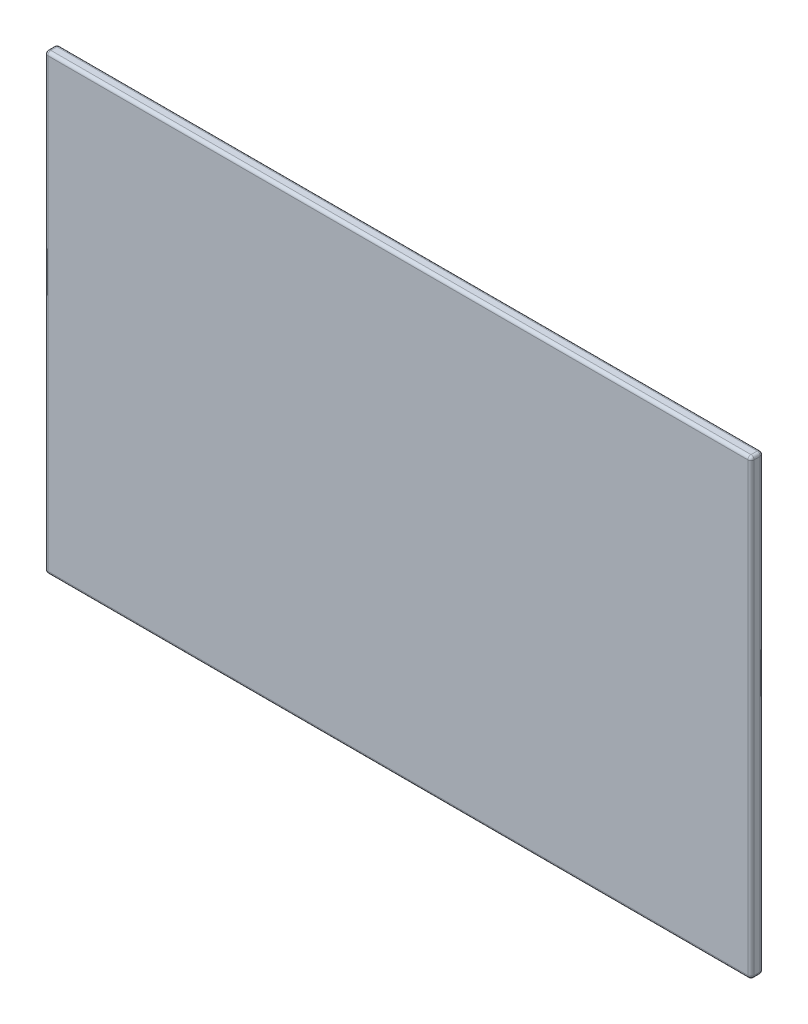
ISO-10303-21;
HEADER;
FILE_DESCRIPTION(('STEP AP214'),'2;1');
FILE_NAME('part.step','',(''),(''),'','','');
FILE_SCHEMA(('AUTOMOTIVE_DESIGN { 1 0 10303 214 1 1 1 1 }'));
ENDSEC;
DATA;
#1=APPLICATION_CONTEXT('core data for automotive mechanical design processes');
#2=APPLICATION_PROTOCOL_DEFINITION('international standard','automotive_design',2000,#1);
#3=PRODUCT_CONTEXT('',#1,'mechanical');
#4=PRODUCT('Part','Part','',(#3));
#5=PRODUCT_RELATED_PRODUCT_CATEGORY('part','',(#4));
#6=PRODUCT_DEFINITION_FORMATION('','',#4);
#7=PRODUCT_DEFINITION_CONTEXT('part definition',#1,'design');
#8=PRODUCT_DEFINITION('design','',#6,#7);
#9=PRODUCT_DEFINITION_SHAPE('','',#8);
#10=(LENGTH_UNIT() NAMED_UNIT(*) SI_UNIT(.MILLI.,.METRE.));
#11=(NAMED_UNIT(*) PLANE_ANGLE_UNIT() SI_UNIT($,.RADIAN.));
#12=(NAMED_UNIT(*) SI_UNIT($,.STERADIAN.) SOLID_ANGLE_UNIT());
#13=UNCERTAINTY_MEASURE_WITH_UNIT(LENGTH_MEASURE(1.E-05),#10,'distance_accuracy_value','');
#14=(GEOMETRIC_REPRESENTATION_CONTEXT(3) GLOBAL_UNCERTAINTY_ASSIGNED_CONTEXT((#13)) GLOBAL_UNIT_ASSIGNED_CONTEXT((#10,
#11,#12)) REPRESENTATION_CONTEXT('',''));
#15=CARTESIAN_POINT('',(0.,0.,0.));
#16=DIRECTION('',(0.,0.,1.));
#17=DIRECTION('',(1.,0.,0.));
#18=AXIS2_PLACEMENT_3D('',#15,#16,#17);
#19=CARTESIAN_POINT('',(57.35,-36.75,2.));
#20=DIRECTION('',(-1.,0.,0.));
#21=DIRECTION('',(0.,0.,1.));
#22=AXIS2_PLACEMENT_3D('',#19,#20,#21);
#23=PLANE('',#22);
#24=DIRECTION('',(0.,1.,0.));
#25=VECTOR('',#24,1.);
#26=CARTESIAN_POINT('',(57.35,-36.75,1.5));
#27=LINE('',#26,#25);
#28=CARTESIAN_POINT('',(57.35,36.25,1.5));
#29=VERTEX_POINT('',#28);
#30=CARTESIAN_POINT('',(57.35,-36.25,1.5));
#31=VERTEX_POINT('',#30);
#32=EDGE_CURVE('E42',#29,#31,#27,.F.);
#33=ORIENTED_EDGE('',*,*,#32,.T.);
#34=DIRECTION('',(0.,0.,-1.));
#35=VECTOR('',#34,1.);
#36=CARTESIAN_POINT('',(57.35,-36.25,2.));
#37=LINE('',#36,#35);
#38=CARTESIAN_POINT('',(57.35,-36.25,0.5));
#39=VERTEX_POINT('',#38);
#40=EDGE_CURVE('E11',#31,#39,#37,.T.);
#41=ORIENTED_EDGE('',*,*,#40,.T.);
#42=DIRECTION('',(0.,1.,0.));
#43=VECTOR('',#42,1.);
#44=CARTESIAN_POINT('',(57.35,36.75,0.5));
#45=LINE('',#44,#43);
#46=CARTESIAN_POINT('',(57.35,36.25,0.5));
#47=VERTEX_POINT('',#46);
#48=EDGE_CURVE('E194',#39,#47,#45,.T.);
#49=ORIENTED_EDGE('',*,*,#48,.T.);
#50=DIRECTION('',(0.,0.,-1.));
#51=VECTOR('',#50,1.);
#52=CARTESIAN_POINT('',(57.35,36.25,2.));
#53=LINE('',#52,#51);
#54=EDGE_CURVE('E53',#47,#29,#53,.F.);
#55=ORIENTED_EDGE('',*,*,#54,.T.);
#56=EDGE_LOOP('',(#33,#41,#49,#55));
#57=FACE_BOUND('',#56,.T.);
#58=ADVANCED_FACE('F33',(#57),#23,.F.);
#59=CARTESIAN_POINT('',(-57.35,36.75,2.));
#60=DIRECTION('',(0.,-1.,0.));
#61=DIRECTION('',(0.,0.,-1.));
#62=AXIS2_PLACEMENT_3D('',#59,#60,#61);
#63=PLANE('',#62);
#64=DIRECTION('',(0.,0.,-1.));
#65=VECTOR('',#64,1.);
#66=CARTESIAN_POINT('',(-56.85,36.75,2.));
#67=LINE('',#66,#65);
#68=CARTESIAN_POINT('',(-56.85,36.75,0.5));
#69=VERTEX_POINT('',#68);
#70=CARTESIAN_POINT('',(-56.85,36.75,1.5));
#71=VERTEX_POINT('',#70);
#72=EDGE_CURVE('E189',#69,#71,#67,.F.);
#73=ORIENTED_EDGE('',*,*,#72,.T.);
#74=DIRECTION('',(-1.,0.,0.));
#75=VECTOR('',#74,1.);
#76=CARTESIAN_POINT('',(-57.35,36.75,1.5));
#77=LINE('',#76,#75);
#78=CARTESIAN_POINT('',(56.85,36.75,1.5));
#79=VERTEX_POINT('',#78);
#80=EDGE_CURVE('E191',#71,#79,#77,.F.);
#81=ORIENTED_EDGE('',*,*,#80,.T.);
#82=DIRECTION('',(0.,0.,-1.));
#83=VECTOR('',#82,1.);
#84=CARTESIAN_POINT('',(56.85,36.75,2.));
#85=LINE('',#84,#83);
#86=CARTESIAN_POINT('',(56.85,36.75,0.5));
#87=VERTEX_POINT('',#86);
#88=EDGE_CURVE('E185',#79,#87,#85,.T.);
#89=ORIENTED_EDGE('',*,*,#88,.T.);
#90=DIRECTION('',(-1.,0.,0.));
#91=VECTOR('',#90,1.);
#92=CARTESIAN_POINT('',(-57.35,36.75,0.5));
#93=LINE('',#92,#91);
#94=EDGE_CURVE('E187',#87,#69,#93,.T.);
#95=ORIENTED_EDGE('',*,*,#94,.T.);
#96=EDGE_LOOP('',(#73,#81,#89,#95));
#97=FACE_BOUND('',#96,.T.);
#98=ADVANCED_FACE('F278',(#97),#63,.F.);
#99=CARTESIAN_POINT('',(-57.35,-36.75,2.));
#100=DIRECTION('',(1.,0.,0.));
#101=DIRECTION('',(0.,0.,-1.));
#102=AXIS2_PLACEMENT_3D('',#99,#100,#101);
#103=PLANE('',#102);
#104=DIRECTION('',(0.,0.,-1.));
#105=VECTOR('',#104,1.);
#106=CARTESIAN_POINT('',(-57.35,-36.25,2.));
#107=LINE('',#106,#105);
#108=CARTESIAN_POINT('',(-57.35,-36.25,0.5));
#109=VERTEX_POINT('',#108);
#110=CARTESIAN_POINT('',(-57.35,-36.25,1.5));
#111=VERTEX_POINT('',#110);
#112=EDGE_CURVE('E180',#109,#111,#107,.F.);
#113=ORIENTED_EDGE('',*,*,#112,.T.);
#114=DIRECTION('',(0.,-1.,0.));
#115=VECTOR('',#114,1.);
#116=CARTESIAN_POINT('',(-57.35,-36.75,1.5));
#117=LINE('',#116,#115);
#118=CARTESIAN_POINT('',(-57.35,36.25,1.5));
#119=VERTEX_POINT('',#118);
#120=EDGE_CURVE('E182',#111,#119,#117,.F.);
#121=ORIENTED_EDGE('',*,*,#120,.T.);
#122=DIRECTION('',(0.,0.,-1.));
#123=VECTOR('',#122,1.);
#124=CARTESIAN_POINT('',(-57.35,36.25,2.));
#125=LINE('',#124,#123);
#126=CARTESIAN_POINT('',(-57.35,36.25,0.5));
#127=VERTEX_POINT('',#126);
#128=EDGE_CURVE('E176',#119,#127,#125,.T.);
#129=ORIENTED_EDGE('',*,*,#128,.T.);
#130=DIRECTION('',(0.,-1.,0.));
#131=VECTOR('',#130,1.);
#132=CARTESIAN_POINT('',(-57.35,-36.75,0.5));
#133=LINE('',#132,#131);
#134=EDGE_CURVE('E178',#127,#109,#133,.T.);
#135=ORIENTED_EDGE('',*,*,#134,.T.);
#136=EDGE_LOOP('',(#113,#121,#129,#135));
#137=FACE_BOUND('',#136,.T.);
#138=ADVANCED_FACE('F269',(#137),#103,.F.);
#139=CARTESIAN_POINT('',(-57.35,-36.75,2.));
#140=DIRECTION('',(0.,1.,0.));
#141=DIRECTION('',(0.,0.,1.));
#142=AXIS2_PLACEMENT_3D('',#139,#140,#141);
#143=PLANE('',#142);
#144=DIRECTION('',(1.,0.,0.));
#145=VECTOR('',#144,1.);
#146=CARTESIAN_POINT('',(-57.35,-36.75,1.5));
#147=LINE('',#146,#145);
#148=CARTESIAN_POINT('',(56.85,-36.75,1.5));
#149=VERTEX_POINT('',#148);
#150=CARTESIAN_POINT('',(-56.85,-36.75,1.5));
#151=VERTEX_POINT('',#150);
#152=EDGE_CURVE('E129',#149,#151,#147,.F.);
#153=ORIENTED_EDGE('',*,*,#152,.T.);
#154=DIRECTION('',(0.,0.,-1.));
#155=VECTOR('',#154,1.);
#156=CARTESIAN_POINT('',(-56.85,-36.75,2.));
#157=LINE('',#156,#155);
#158=CARTESIAN_POINT('',(-56.85,-36.75,0.5));
#159=VERTEX_POINT('',#158);
#160=EDGE_CURVE('E165',#151,#159,#157,.T.);
#161=ORIENTED_EDGE('',*,*,#160,.T.);
#162=DIRECTION('',(1.,0.,0.));
#163=VECTOR('',#162,1.);
#164=CARTESIAN_POINT('',(57.35,-36.75,0.5));
#165=LINE('',#164,#163);
#166=CARTESIAN_POINT('',(56.85,-36.75,0.5));
#167=VERTEX_POINT('',#166);
#168=EDGE_CURVE('E158',#159,#167,#165,.T.);
#169=ORIENTED_EDGE('',*,*,#168,.T.);
#170=DIRECTION('',(0.,0.,-1.));
#171=VECTOR('',#170,1.);
#172=CARTESIAN_POINT('',(56.85,-36.75,2.));
#173=LINE('',#172,#171);
#174=EDGE_CURVE('E156',#167,#149,#173,.F.);
#175=ORIENTED_EDGE('',*,*,#174,.T.);
#176=EDGE_LOOP('',(#153,#161,#169,#175));
#177=FACE_BOUND('',#176,.T.);
#178=ADVANCED_FACE('F356',(#177),#143,.F.);
#179=CARTESIAN_POINT('',(0.,0.,2.));
#180=DIRECTION('',(0.,0.,-1.));
#181=DIRECTION('',(-1.,0.,0.));
#182=AXIS2_PLACEMENT_3D('',#179,#180,#181);
#183=PLANE('',#182);
#184=DIRECTION('',(0.,-1.,0.));
#185=VECTOR('',#184,1.);
#186=CARTESIAN_POINT('',(-56.85,0.,2.));
#187=LINE('',#186,#185);
#188=CARTESIAN_POINT('',(-56.85,36.25,2.));
#189=VERTEX_POINT('',#188);
#190=CARTESIAN_POINT('',(-56.85,-36.25,2.));
#191=VERTEX_POINT('',#190);
#192=EDGE_CURVE('E154',#189,#191,#187,.T.);
#193=ORIENTED_EDGE('',*,*,#192,.T.);
#194=DIRECTION('',(1.,0.,0.));
#195=VECTOR('',#194,1.);
#196=CARTESIAN_POINT('',(0.,-36.25,2.));
#197=LINE('',#196,#195);
#198=CARTESIAN_POINT('',(56.85,-36.25,2.));
#199=VERTEX_POINT('',#198);
#200=EDGE_CURVE('E127',#191,#199,#197,.T.);
#201=ORIENTED_EDGE('',*,*,#200,.T.);
#202=DIRECTION('',(0.,1.,0.));
#203=VECTOR('',#202,1.);
#204=CARTESIAN_POINT('',(56.85,0.,2.));
#205=LINE('',#204,#203);
#206=CARTESIAN_POINT('',(56.85,36.25,2.));
#207=VERTEX_POINT('',#206);
#208=EDGE_CURVE('E144',#199,#207,#205,.T.);
#209=ORIENTED_EDGE('',*,*,#208,.T.);
#210=DIRECTION('',(-1.,0.,0.));
#211=VECTOR('',#210,1.);
#212=CARTESIAN_POINT('',(0.,36.25,2.));
#213=LINE('',#212,#211);
#214=EDGE_CURVE('E150',#207,#189,#213,.T.);
#215=ORIENTED_EDGE('',*,*,#214,.T.);
#216=EDGE_LOOP('',(#193,#201,#209,#215));
#217=FACE_BOUND('',#216,.T.);
#218=ADVANCED_FACE('F152',(#217),#183,.F.);
#219=CARTESIAN_POINT('',(0.,0.,0.));
#220=DIRECTION('',(0.,0.,-1.));
#221=DIRECTION('',(-1.,0.,0.));
#222=AXIS2_PLACEMENT_3D('',#219,#220,#221);
#223=PLANE('',#222);
#224=DIRECTION('',(0.,1.,0.));
#225=VECTOR('',#224,1.);
#226=CARTESIAN_POINT('',(56.85,-36.75,0.));
#227=LINE('',#226,#225);
#228=CARTESIAN_POINT('',(56.85,36.25,0.));
#229=VERTEX_POINT('',#228);
#230=CARTESIAN_POINT('',(56.85,-36.25,0.));
#231=VERTEX_POINT('',#230);
#232=EDGE_CURVE('E167',#229,#231,#227,.F.);
#233=ORIENTED_EDGE('',*,*,#232,.T.);
#234=DIRECTION('',(1.,0.,0.));
#235=VECTOR('',#234,1.);
#236=CARTESIAN_POINT('',(-57.35,-36.25,0.));
#237=LINE('',#236,#235);
#238=CARTESIAN_POINT('',(-56.85,-36.25,0.));
#239=VERTEX_POINT('',#238);
#240=EDGE_CURVE('E173',#231,#239,#237,.F.);
#241=ORIENTED_EDGE('',*,*,#240,.T.);
#242=DIRECTION('',(0.,-1.,0.));
#243=VECTOR('',#242,1.);
#244=CARTESIAN_POINT('',(-56.85,36.75,0.));
#245=LINE('',#244,#243);
#246=CARTESIAN_POINT('',(-56.85,36.25,0.));
#247=VERTEX_POINT('',#246);
#248=EDGE_CURVE('E171',#239,#247,#245,.F.);
#249=ORIENTED_EDGE('',*,*,#248,.T.);
#250=DIRECTION('',(-1.,0.,0.));
#251=VECTOR('',#250,1.);
#252=CARTESIAN_POINT('',(57.35,36.25,0.));
#253=LINE('',#252,#251);
#254=EDGE_CURVE('E169',#247,#229,#253,.F.);
#255=ORIENTED_EDGE('',*,*,#254,.T.);
#256=EDGE_LOOP('',(#233,#241,#249,#255));
#257=FACE_BOUND('',#256,.T.);
#258=ADVANCED_FACE('F296',(#257),#223,.T.);
#259=CARTESIAN_POINT('',(-57.35,36.25,0.5));
#260=DIRECTION('',(1.,0.,0.));
#261=DIRECTION('',(0.,0.,-1.));
#262=AXIS2_PLACEMENT_3D('',#259,#260,#261);
#263=CYLINDRICAL_SURFACE('',#262,0.5);
#264=CARTESIAN_POINT('',(-56.85,36.25,0.5));
#265=DIRECTION('',(-1.,0.,0.));
#266=DIRECTION('',(0.,0.,1.));
#267=AXIS2_PLACEMENT_3D('',#264,#265,#266);
#268=CIRCLE('',#267,0.5);
#269=EDGE_CURVE('E37',#69,#247,#268,.T.);
#270=ORIENTED_EDGE('',*,*,#269,.F.);
#271=ORIENTED_EDGE('',*,*,#94,.F.);
#272=CARTESIAN_POINT('',(56.85,36.25,0.5));
#273=DIRECTION('',(1.,0.,0.));
#274=DIRECTION('',(0.,0.,-1.));
#275=AXIS2_PLACEMENT_3D('',#272,#273,#274);
#276=CIRCLE('',#275,0.5);
#277=EDGE_CURVE('E246',#229,#87,#276,.T.);
#278=ORIENTED_EDGE('',*,*,#277,.F.);
#279=ORIENTED_EDGE('',*,*,#254,.F.);
#280=EDGE_LOOP('',(#270,#271,#278,#279));
#281=FACE_BOUND('',#280,.T.);
#282=ADVANCED_FACE('F35',(#281),#263,.T.);
#283=CARTESIAN_POINT('',(-56.85,36.25,0.5));
#284=DIRECTION('',(0.,0.,1.));
#285=DIRECTION('',(1.,0.,0.));
#286=AXIS2_PLACEMENT_3D('',#283,#284,#285);
#287=SPHERICAL_SURFACE('',#286,0.5);
#288=CARTESIAN_POINT('',(-56.85,36.25,0.5));
#289=DIRECTION('',(0.,0.,-1.));
#290=DIRECTION('',(-1.,0.,0.));
#291=AXIS2_PLACEMENT_3D('',#288,#289,#290);
#292=CIRCLE('',#291,0.5);
#293=EDGE_CURVE('E241',#69,#127,#292,.F.);
#294=ORIENTED_EDGE('',*,*,#293,.F.);
#295=ORIENTED_EDGE('',*,*,#269,.T.);
#296=CARTESIAN_POINT('',(-56.85,36.25,0.5));
#297=DIRECTION('',(0.,1.,0.));
#298=DIRECTION('',(0.,0.,1.));
#299=AXIS2_PLACEMENT_3D('',#296,#297,#298);
#300=CIRCLE('',#299,0.5);
#301=EDGE_CURVE('E244',#127,#247,#300,.F.);
#302=ORIENTED_EDGE('',*,*,#301,.F.);
#303=EDGE_LOOP('',(#294,#295,#302));
#304=FACE_BOUND('',#303,.T.);
#305=ADVANCED_FACE('F257',(#304),#287,.T.);
#306=CARTESIAN_POINT('',(56.85,36.25,0.5));
#307=DIRECTION('',(0.,0.,1.));
#308=DIRECTION('',(1.,0.,0.));
#309=AXIS2_PLACEMENT_3D('',#306,#307,#308);
#310=SPHERICAL_SURFACE('',#309,0.5);
#311=CARTESIAN_POINT('',(56.85,36.25,0.5));
#312=DIRECTION('',(0.,1.,0.));
#313=DIRECTION('',(0.,0.,1.));
#314=AXIS2_PLACEMENT_3D('',#311,#312,#313);
#315=CIRCLE('',#314,0.5);
#316=EDGE_CURVE('E235',#229,#47,#315,.F.);
#317=ORIENTED_EDGE('',*,*,#316,.F.);
#318=ORIENTED_EDGE('',*,*,#277,.T.);
#319=CARTESIAN_POINT('',(56.85,36.25,0.5));
#320=DIRECTION('',(0.,0.,-1.));
#321=DIRECTION('',(-1.,0.,0.));
#322=AXIS2_PLACEMENT_3D('',#319,#320,#321);
#323=CIRCLE('',#322,0.5);
#324=EDGE_CURVE('E238',#47,#87,#323,.F.);
#325=ORIENTED_EDGE('',*,*,#324,.F.);
#326=EDGE_LOOP('',(#317,#318,#325));
#327=FACE_BOUND('',#326,.T.);
#328=ADVANCED_FACE('F289',(#327),#310,.T.);
#329=CARTESIAN_POINT('',(-56.85,-36.75,0.5));
#330=DIRECTION('',(0.,1.,0.));
#331=DIRECTION('',(0.,0.,1.));
#332=AXIS2_PLACEMENT_3D('',#329,#330,#331);
#333=CYLINDRICAL_SURFACE('',#332,0.5);
#334=ORIENTED_EDGE('',*,*,#301,.T.);
#335=ORIENTED_EDGE('',*,*,#248,.F.);
#336=CARTESIAN_POINT('',(-56.85,-36.25,0.5));
#337=DIRECTION('',(0.,-1.,0.));
#338=DIRECTION('',(0.,0.,-1.));
#339=AXIS2_PLACEMENT_3D('',#336,#337,#338);
#340=CIRCLE('',#339,0.5);
#341=EDGE_CURVE('E230',#109,#239,#340,.T.);
#342=ORIENTED_EDGE('',*,*,#341,.F.);
#343=ORIENTED_EDGE('',*,*,#134,.F.);
#344=EDGE_LOOP('',(#334,#335,#342,#343));
#345=FACE_BOUND('',#344,.T.);
#346=ADVANCED_FACE('F265',(#345),#333,.T.);
#347=CARTESIAN_POINT('',(-56.85,36.25,2.));
#348=DIRECTION('',(0.,0.,-1.));
#349=DIRECTION('',(-1.,0.,0.));
#350=AXIS2_PLACEMENT_3D('',#347,#348,#349);
#351=CYLINDRICAL_SURFACE('',#350,0.5);
#352=ORIENTED_EDGE('',*,*,#293,.T.);
#353=ORIENTED_EDGE('',*,*,#128,.F.);
#354=CARTESIAN_POINT('',(-56.85,36.25,1.5));
#355=DIRECTION('',(0.,0.,1.));
#356=DIRECTION('',(1.,0.,0.));
#357=AXIS2_PLACEMENT_3D('',#354,#355,#356);
#358=CIRCLE('',#357,0.5);
#359=EDGE_CURVE('E227',#71,#119,#358,.T.);
#360=ORIENTED_EDGE('',*,*,#359,.F.);
#361=ORIENTED_EDGE('',*,*,#72,.F.);
#362=EDGE_LOOP('',(#352,#353,#360,#361));
#363=FACE_BOUND('',#362,.T.);
#364=ADVANCED_FACE('F275',(#363),#351,.T.);
#365=CARTESIAN_POINT('',(0.,36.25,1.5));
#366=DIRECTION('',(-1.,0.,0.));
#367=DIRECTION('',(0.,0.,1.));
#368=AXIS2_PLACEMENT_3D('',#365,#366,#367);
#369=CYLINDRICAL_SURFACE('',#368,0.5);
#370=CARTESIAN_POINT('',(56.85,36.25,1.5));
#371=DIRECTION('',(1.,0.,0.));
#372=DIRECTION('',(0.,0.,-1.));
#373=AXIS2_PLACEMENT_3D('',#370,#371,#372);
#374=CIRCLE('',#373,0.5);
#375=EDGE_CURVE('E221',#79,#207,#374,.T.);
#376=ORIENTED_EDGE('',*,*,#375,.F.);
#377=ORIENTED_EDGE('',*,*,#80,.F.);
#378=CARTESIAN_POINT('',(-56.85,36.25,1.5));
#379=DIRECTION('',(-1.,0.,0.));
#380=DIRECTION('',(0.,0.,1.));
#381=AXIS2_PLACEMENT_3D('',#378,#379,#380);
#382=CIRCLE('',#381,0.5);
#383=EDGE_CURVE('E224',#189,#71,#382,.T.);
#384=ORIENTED_EDGE('',*,*,#383,.F.);
#385=ORIENTED_EDGE('',*,*,#214,.F.);
#386=EDGE_LOOP('',(#376,#377,#384,#385));
#387=FACE_BOUND('',#386,.T.);
#388=ADVANCED_FACE('F282',(#387),#369,.T.);
#389=CARTESIAN_POINT('',(56.85,36.25,2.));
#390=DIRECTION('',(0.,0.,-1.));
#391=DIRECTION('',(-1.,0.,0.));
#392=AXIS2_PLACEMENT_3D('',#389,#390,#391);
#393=CYLINDRICAL_SURFACE('',#392,0.5);
#394=ORIENTED_EDGE('',*,*,#324,.T.);
#395=ORIENTED_EDGE('',*,*,#88,.F.);
#396=CARTESIAN_POINT('',(56.85,36.25,1.5));
#397=DIRECTION('',(0.,0.,1.));
#398=DIRECTION('',(1.,0.,0.));
#399=AXIS2_PLACEMENT_3D('',#396,#397,#398);
#400=CIRCLE('',#399,0.5);
#401=EDGE_CURVE('E219',#29,#79,#400,.T.);
#402=ORIENTED_EDGE('',*,*,#401,.F.);
#403=ORIENTED_EDGE('',*,*,#54,.F.);
#404=EDGE_LOOP('',(#394,#395,#402,#403));
#405=FACE_BOUND('',#404,.T.);
#406=ADVANCED_FACE('F287',(#405),#393,.T.);
#407=CARTESIAN_POINT('',(56.85,-36.75,0.5));
#408=DIRECTION('',(0.,-1.,0.));
#409=DIRECTION('',(0.,0.,-1.));
#410=AXIS2_PLACEMENT_3D('',#407,#408,#409);
#411=CYLINDRICAL_SURFACE('',#410,0.5);
#412=ORIENTED_EDGE('',*,*,#316,.T.);
#413=ORIENTED_EDGE('',*,*,#48,.F.);
#414=CARTESIAN_POINT('',(56.85,-36.25,0.5));
#415=DIRECTION('',(0.,-1.,0.));
#416=DIRECTION('',(0.,0.,-1.));
#417=AXIS2_PLACEMENT_3D('',#414,#415,#416);
#418=CIRCLE('',#417,0.5);
#419=EDGE_CURVE('E216',#231,#39,#418,.T.);
#420=ORIENTED_EDGE('',*,*,#419,.F.);
#421=ORIENTED_EDGE('',*,*,#232,.F.);
#422=EDGE_LOOP('',(#412,#413,#420,#421));
#423=FACE_BOUND('',#422,.T.);
#424=ADVANCED_FACE('F293',(#423),#411,.T.);
#425=CARTESIAN_POINT('',(-57.35,-36.25,0.5));
#426=DIRECTION('',(-1.,0.,0.));
#427=DIRECTION('',(0.,0.,1.));
#428=AXIS2_PLACEMENT_3D('',#425,#426,#427);
#429=CYLINDRICAL_SURFACE('',#428,0.5);
#430=CARTESIAN_POINT('',(-56.85,-36.25,0.5));
#431=DIRECTION('',(-1.,0.,0.));
#432=DIRECTION('',(0.,0.,1.));
#433=AXIS2_PLACEMENT_3D('',#430,#431,#432);
#434=CIRCLE('',#433,0.5);
#435=EDGE_CURVE('E232',#239,#159,#434,.T.);
#436=ORIENTED_EDGE('',*,*,#435,.F.);
#437=ORIENTED_EDGE('',*,*,#240,.F.);
#438=CARTESIAN_POINT('',(56.85,-36.25,0.5));
#439=DIRECTION('',(1.,0.,0.));
#440=DIRECTION('',(0.,0.,-1.));
#441=AXIS2_PLACEMENT_3D('',#438,#439,#440);
#442=CIRCLE('',#441,0.5);
#443=EDGE_CURVE('E213',#167,#231,#442,.T.);
#444=ORIENTED_EDGE('',*,*,#443,.F.);
#445=ORIENTED_EDGE('',*,*,#168,.F.);
#446=EDGE_LOOP('',(#436,#437,#444,#445));
#447=FACE_BOUND('',#446,.T.);
#448=ADVANCED_FACE('F300',(#447),#429,.T.);
#449=CARTESIAN_POINT('',(-56.85,-36.25,0.5));
#450=DIRECTION('',(0.,0.,1.));
#451=DIRECTION('',(1.,0.,0.));
#452=AXIS2_PLACEMENT_3D('',#449,#450,#451);
#453=SPHERICAL_SURFACE('',#452,0.5);
#454=ORIENTED_EDGE('',*,*,#341,.T.);
#455=ORIENTED_EDGE('',*,*,#435,.T.);
#456=CARTESIAN_POINT('',(-56.85,-36.25,0.5));
#457=DIRECTION('',(0.,0.,-1.));
#458=DIRECTION('',(-1.,0.,0.));
#459=AXIS2_PLACEMENT_3D('',#456,#457,#458);
#460=CIRCLE('',#459,0.5);
#461=EDGE_CURVE('E210',#109,#159,#460,.F.);
#462=ORIENTED_EDGE('',*,*,#461,.F.);
#463=EDGE_LOOP('',(#454,#455,#462));
#464=FACE_BOUND('',#463,.T.);
#465=ADVANCED_FACE('F304',(#464),#453,.T.);
#466=CARTESIAN_POINT('',(-56.85,36.25,1.5));
#467=DIRECTION('',(0.,0.,1.));
#468=DIRECTION('',(1.,0.,0.));
#469=AXIS2_PLACEMENT_3D('',#466,#467,#468);
#470=SPHERICAL_SURFACE('',#469,0.5);
#471=ORIENTED_EDGE('',*,*,#383,.T.);
#472=ORIENTED_EDGE('',*,*,#359,.T.);
#473=CARTESIAN_POINT('',(-56.85,36.25,1.5));
#474=DIRECTION('',(0.,1.,0.));
#475=DIRECTION('',(0.,0.,1.));
#476=AXIS2_PLACEMENT_3D('',#473,#474,#475);
#477=CIRCLE('',#476,0.5);
#478=EDGE_CURVE('E208',#189,#119,#477,.F.);
#479=ORIENTED_EDGE('',*,*,#478,.F.);
#480=EDGE_LOOP('',(#471,#472,#479));
#481=FACE_BOUND('',#480,.T.);
#482=ADVANCED_FACE('F315',(#481),#470,.T.);
#483=CARTESIAN_POINT('',(56.85,36.25,1.5));
#484=DIRECTION('',(0.,0.,1.));
#485=DIRECTION('',(1.,0.,0.));
#486=AXIS2_PLACEMENT_3D('',#483,#484,#485);
#487=SPHERICAL_SURFACE('',#486,0.5);
#488=ORIENTED_EDGE('',*,*,#401,.T.);
#489=ORIENTED_EDGE('',*,*,#375,.T.);
#490=CARTESIAN_POINT('',(56.85,36.25,1.5));
#491=DIRECTION('',(0.,1.,0.));
#492=DIRECTION('',(0.,0.,1.));
#493=AXIS2_PLACEMENT_3D('',#490,#491,#492);
#494=CIRCLE('',#493,0.5);
#495=EDGE_CURVE('E147',#29,#207,#494,.F.);
#496=ORIENTED_EDGE('',*,*,#495,.F.);
#497=EDGE_LOOP('',(#488,#489,#496));
#498=FACE_BOUND('',#497,.T.);
#499=ADVANCED_FACE('F317',(#498),#487,.T.);
#500=CARTESIAN_POINT('',(56.85,-36.25,0.5));
#501=DIRECTION('',(0.,0.,1.));
#502=DIRECTION('',(1.,0.,0.));
#503=AXIS2_PLACEMENT_3D('',#500,#501,#502);
#504=SPHERICAL_SURFACE('',#503,0.5);
#505=ORIENTED_EDGE('',*,*,#443,.T.);
#506=ORIENTED_EDGE('',*,*,#419,.T.);
#507=CARTESIAN_POINT('',(56.85,-36.25,0.5));
#508=DIRECTION('',(0.,0.,-1.));
#509=DIRECTION('',(-1.,0.,0.));
#510=AXIS2_PLACEMENT_3D('',#507,#508,#509);
#511=CIRCLE('',#510,0.5);
#512=EDGE_CURVE('E205',#167,#39,#511,.F.);
#513=ORIENTED_EDGE('',*,*,#512,.F.);
#514=EDGE_LOOP('',(#505,#506,#513));
#515=FACE_BOUND('',#514,.T.);
#516=ADVANCED_FACE('F323',(#515),#504,.T.);
#517=CARTESIAN_POINT('',(-56.85,-36.25,2.));
#518=DIRECTION('',(0.,0.,-1.));
#519=DIRECTION('',(-1.,0.,0.));
#520=AXIS2_PLACEMENT_3D('',#517,#518,#519);
#521=CYLINDRICAL_SURFACE('',#520,0.5);
#522=ORIENTED_EDGE('',*,*,#461,.T.);
#523=ORIENTED_EDGE('',*,*,#160,.F.);
#524=CARTESIAN_POINT('',(-56.85,-36.25,1.5));
#525=DIRECTION('',(0.,0.,1.));
#526=DIRECTION('',(1.,0.,0.));
#527=AXIS2_PLACEMENT_3D('',#524,#525,#526);
#528=CIRCLE('',#527,0.5);
#529=EDGE_CURVE('E202',#111,#151,#528,.T.);
#530=ORIENTED_EDGE('',*,*,#529,.F.);
#531=ORIENTED_EDGE('',*,*,#112,.F.);
#532=EDGE_LOOP('',(#522,#523,#530,#531));
#533=FACE_BOUND('',#532,.T.);
#534=ADVANCED_FACE('F307',(#533),#521,.T.);
#535=CARTESIAN_POINT('',(-56.85,0.,1.5));
#536=DIRECTION('',(0.,-1.,0.));
#537=DIRECTION('',(0.,0.,-1.));
#538=AXIS2_PLACEMENT_3D('',#535,#536,#537);
#539=CYLINDRICAL_SURFACE('',#538,0.5);
#540=ORIENTED_EDGE('',*,*,#478,.T.);
#541=ORIENTED_EDGE('',*,*,#120,.F.);
#542=CARTESIAN_POINT('',(-56.85,-36.25,1.5));
#543=DIRECTION('',(0.,-1.,0.));
#544=DIRECTION('',(0.,0.,-1.));
#545=AXIS2_PLACEMENT_3D('',#542,#543,#544);
#546=CIRCLE('',#545,0.5);
#547=EDGE_CURVE('E141',#191,#111,#546,.T.);
#548=ORIENTED_EDGE('',*,*,#547,.F.);
#549=ORIENTED_EDGE('',*,*,#192,.F.);
#550=EDGE_LOOP('',(#540,#541,#548,#549));
#551=FACE_BOUND('',#550,.T.);
#552=ADVANCED_FACE('F313',(#551),#539,.T.);
#553=CARTESIAN_POINT('',(56.85,0.,1.5));
#554=DIRECTION('',(0.,1.,0.));
#555=DIRECTION('',(0.,0.,1.));
#556=AXIS2_PLACEMENT_3D('',#553,#554,#555);
#557=CYLINDRICAL_SURFACE('',#556,0.5);
#558=ORIENTED_EDGE('',*,*,#495,.T.);
#559=ORIENTED_EDGE('',*,*,#208,.F.);
#560=CARTESIAN_POINT('',(56.85,-36.25,1.5));
#561=DIRECTION('',(0.,-1.,0.));
#562=DIRECTION('',(0.,0.,-1.));
#563=AXIS2_PLACEMENT_3D('',#560,#561,#562);
#564=CIRCLE('',#563,0.5);
#565=EDGE_CURVE('E135',#31,#199,#564,.T.);
#566=ORIENTED_EDGE('',*,*,#565,.F.);
#567=ORIENTED_EDGE('',*,*,#32,.F.);
#568=EDGE_LOOP('',(#558,#559,#566,#567));
#569=FACE_BOUND('',#568,.T.);
#570=ADVANCED_FACE('F145',(#569),#557,.T.);
#571=CARTESIAN_POINT('',(56.85,-36.25,2.));
#572=DIRECTION('',(0.,0.,-1.));
#573=DIRECTION('',(-1.,0.,0.));
#574=AXIS2_PLACEMENT_3D('',#571,#572,#573);
#575=CYLINDRICAL_SURFACE('',#574,0.5);
#576=ORIENTED_EDGE('',*,*,#512,.T.);
#577=ORIENTED_EDGE('',*,*,#40,.F.);
#578=CARTESIAN_POINT('',(56.85,-36.25,1.5));
#579=DIRECTION('',(0.,0.,1.));
#580=DIRECTION('',(1.,0.,0.));
#581=AXIS2_PLACEMENT_3D('',#578,#579,#580);
#582=CIRCLE('',#581,0.5);
#583=EDGE_CURVE('E139',#149,#31,#582,.T.);
#584=ORIENTED_EDGE('',*,*,#583,.F.);
#585=ORIENTED_EDGE('',*,*,#174,.F.);
#586=EDGE_LOOP('',(#576,#577,#584,#585));
#587=FACE_BOUND('',#586,.T.);
#588=ADVANCED_FACE('F340',(#587),#575,.T.);
#589=CARTESIAN_POINT('',(-56.85,-36.25,1.5));
#590=DIRECTION('',(0.,0.,1.));
#591=DIRECTION('',(1.,0.,0.));
#592=AXIS2_PLACEMENT_3D('',#589,#590,#591);
#593=SPHERICAL_SURFACE('',#592,0.5);
#594=ORIENTED_EDGE('',*,*,#547,.T.);
#595=ORIENTED_EDGE('',*,*,#529,.T.);
#596=CARTESIAN_POINT('',(-56.85,-36.25,1.5));
#597=DIRECTION('',(-1.,0.,0.));
#598=DIRECTION('',(0.,0.,1.));
#599=AXIS2_PLACEMENT_3D('',#596,#597,#598);
#600=CIRCLE('',#599,0.5);
#601=EDGE_CURVE('E132',#191,#151,#600,.F.);
#602=ORIENTED_EDGE('',*,*,#601,.F.);
#603=EDGE_LOOP('',(#594,#595,#602));
#604=FACE_BOUND('',#603,.T.);
#605=ADVANCED_FACE('F311',(#604),#593,.T.);
#606=CARTESIAN_POINT('',(56.85,-36.25,1.5));
#607=DIRECTION('',(0.,0.,1.));
#608=DIRECTION('',(1.,0.,0.));
#609=AXIS2_PLACEMENT_3D('',#606,#607,#608);
#610=SPHERICAL_SURFACE('',#609,0.5);
#611=ORIENTED_EDGE('',*,*,#583,.T.);
#612=ORIENTED_EDGE('',*,*,#565,.T.);
#613=CARTESIAN_POINT('',(56.85,-36.25,1.5));
#614=DIRECTION('',(1.,0.,0.));
#615=DIRECTION('',(0.,0.,-1.));
#616=AXIS2_PLACEMENT_3D('',#613,#614,#615);
#617=CIRCLE('',#616,0.5);
#618=EDGE_CURVE('E123',#149,#199,#617,.F.);
#619=ORIENTED_EDGE('',*,*,#618,.F.);
#620=EDGE_LOOP('',(#611,#612,#619));
#621=FACE_BOUND('',#620,.T.);
#622=ADVANCED_FACE('F137',(#621),#610,.T.);
#623=CARTESIAN_POINT('',(0.,-36.25,1.5));
#624=DIRECTION('',(1.,0.,0.));
#625=DIRECTION('',(0.,0.,-1.));
#626=AXIS2_PLACEMENT_3D('',#623,#624,#625);
#627=CYLINDRICAL_SURFACE('',#626,0.5);
#628=ORIENTED_EDGE('',*,*,#601,.T.);
#629=ORIENTED_EDGE('',*,*,#152,.F.);
#630=ORIENTED_EDGE('',*,*,#618,.T.);
#631=ORIENTED_EDGE('',*,*,#200,.F.);
#632=EDGE_LOOP('',(#628,#629,#630,#631));
#633=FACE_BOUND('',#632,.T.);
#634=ADVANCED_FACE('F125',(#633),#627,.T.);
#635=CLOSED_SHELL('',(#58,#98,#138,#178,#218,#258,#282,#305,#328,#346,#364,#388,#406,#424,#448,
#465,#482,#499,#516,#534,#552,#570,#588,#605,#622,#634));
#636=MANIFOLD_SOLID_BREP('B2',#635);
#637=ADVANCED_BREP_SHAPE_REPRESENTATION('',(#18,#636),#14);
#638=SHAPE_DEFINITION_REPRESENTATION(#9,#637);
ENDSEC;
END-ISO-10303-21;
